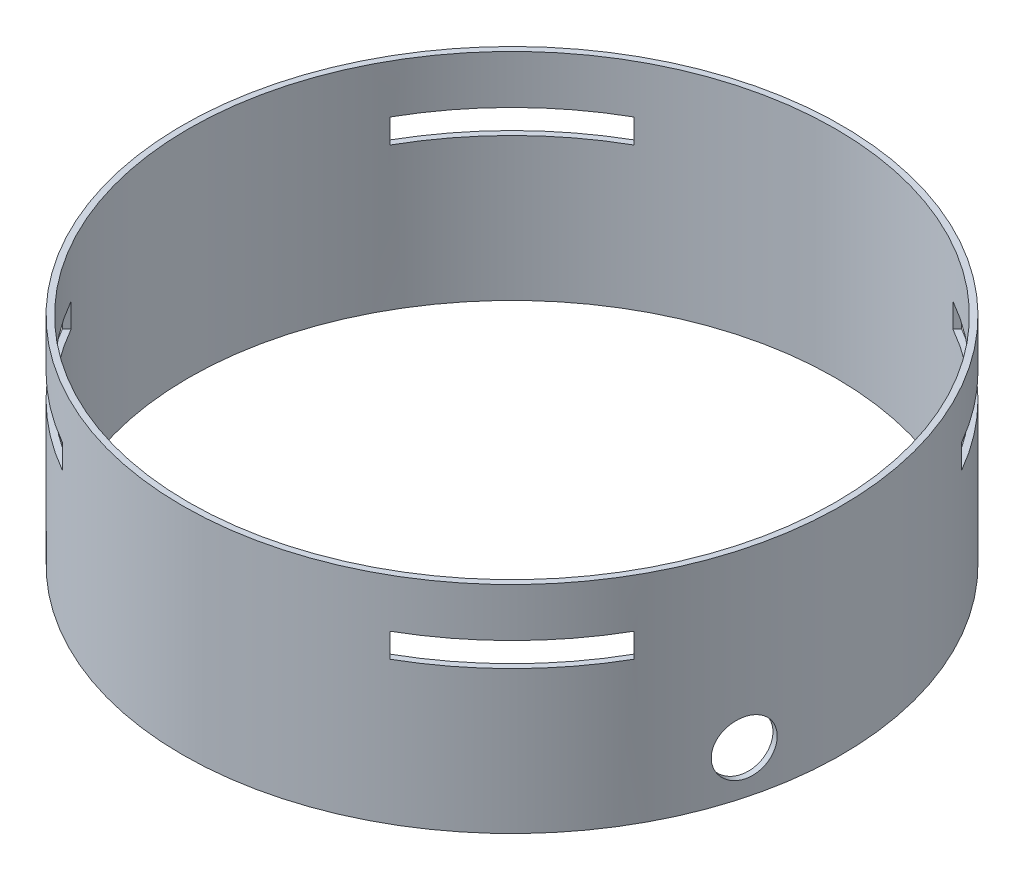
ISO-10303-21;
HEADER;
FILE_DESCRIPTION(('STEP AP214'),'2;1');
FILE_NAME('part.step','',(''),(''),'','','');
FILE_SCHEMA(('AUTOMOTIVE_DESIGN { 1 0 10303 214 1 1 1 1 }'));
ENDSEC;
DATA;
#1=APPLICATION_CONTEXT('core data for automotive mechanical design processes');
#2=APPLICATION_PROTOCOL_DEFINITION('international standard','automotive_design',2000,#1);
#3=PRODUCT_CONTEXT('',#1,'mechanical');
#4=PRODUCT('Part','Part','',(#3));
#5=PRODUCT_RELATED_PRODUCT_CATEGORY('part','',(#4));
#6=PRODUCT_DEFINITION_FORMATION('','',#4);
#7=PRODUCT_DEFINITION_CONTEXT('part definition',#1,'design');
#8=PRODUCT_DEFINITION('design','',#6,#7);
#9=PRODUCT_DEFINITION_SHAPE('','',#8);
#10=(LENGTH_UNIT() NAMED_UNIT(*) SI_UNIT(.MILLI.,.METRE.));
#11=(NAMED_UNIT(*) PLANE_ANGLE_UNIT() SI_UNIT($,.RADIAN.));
#12=(NAMED_UNIT(*) SI_UNIT($,.STERADIAN.) SOLID_ANGLE_UNIT());
#13=UNCERTAINTY_MEASURE_WITH_UNIT(LENGTH_MEASURE(1.E-05),#10,'distance_accuracy_value','');
#14=(GEOMETRIC_REPRESENTATION_CONTEXT(3) GLOBAL_UNCERTAINTY_ASSIGNED_CONTEXT((#13)) GLOBAL_UNIT_ASSIGNED_CONTEXT((#10,
#11,#12)) REPRESENTATION_CONTEXT('',''));
#15=CARTESIAN_POINT('',(0.,0.,0.));
#16=DIRECTION('',(0.,0.,1.));
#17=DIRECTION('',(1.,0.,0.));
#18=AXIS2_PLACEMENT_3D('',#15,#16,#17);
#19=CARTESIAN_POINT('',(0.,25.4,0.));
#20=DIRECTION('',(0.,1.,0.));
#21=DIRECTION('',(0.,0.,1.));
#22=AXIS2_PLACEMENT_3D('',#19,#20,#21);
#23=PLANE('',#22);
#24=CARTESIAN_POINT('',(0.,25.4,0.));
#25=DIRECTION('',(0.,1.,0.));
#26=DIRECTION('',(0.,0.,1.));
#27=AXIS2_PLACEMENT_3D('',#24,#25,#26);
#28=CIRCLE('',#27,77.6224);
#29=CARTESIAN_POINT('',(0.,25.4,77.6224));
#30=VERTEX_POINT('',#29);
#31=EDGE_CURVE('E286',#30,#30,#28,.T.);
#32=ORIENTED_EDGE('',*,*,#31,.T.);
#33=EDGE_LOOP('',(#32));
#34=FACE_BOUND('',#33,.T.);
#35=CARTESIAN_POINT('',(0.,25.4,0.));
#36=DIRECTION('',(0.,1.,0.));
#37=DIRECTION('',(0.,0.,1.));
#38=AXIS2_PLACEMENT_3D('',#35,#36,#37);
#39=CIRCLE('',#38,76.2);
#40=CARTESIAN_POINT('',(0.,25.4,76.2));
#41=VERTEX_POINT('',#40);
#42=EDGE_CURVE('E280',#41,#41,#39,.T.);
#43=ORIENTED_EDGE('',*,*,#42,.F.);
#44=EDGE_LOOP('',(#43));
#45=FACE_BOUND('',#44,.T.);
#46=ADVANCED_FACE('F35',(#34,#45),#23,.T.);
#47=CARTESIAN_POINT('',(0.,-25.4,0.));
#48=DIRECTION('',(0.,1.,0.));
#49=DIRECTION('',(0.,0.,1.));
#50=AXIS2_PLACEMENT_3D('',#47,#48,#49);
#51=PLANE('',#50);
#52=CARTESIAN_POINT('',(0.,-25.4,0.));
#53=DIRECTION('',(0.,1.,0.));
#54=DIRECTION('',(0.,0.,1.));
#55=AXIS2_PLACEMENT_3D('',#52,#53,#54);
#56=CIRCLE('',#55,77.6224);
#57=CARTESIAN_POINT('',(0.,-25.4,77.6224));
#58=VERTEX_POINT('',#57);
#59=EDGE_CURVE('E283',#58,#58,#56,.T.);
#60=ORIENTED_EDGE('',*,*,#59,.F.);
#61=EDGE_LOOP('',(#60));
#62=FACE_BOUND('',#61,.T.);
#63=CARTESIAN_POINT('',(0.,-25.4,0.));
#64=DIRECTION('',(0.,1.,0.));
#65=DIRECTION('',(0.,0.,1.));
#66=AXIS2_PLACEMENT_3D('',#63,#64,#65);
#67=CIRCLE('',#66,76.2);
#68=CARTESIAN_POINT('',(0.,-25.4,76.2));
#69=VERTEX_POINT('',#68);
#70=EDGE_CURVE('E279',#69,#69,#67,.T.);
#71=ORIENTED_EDGE('',*,*,#70,.T.);
#72=EDGE_LOOP('',(#71));
#73=FACE_BOUND('',#72,.T.);
#74=ADVANCED_FACE('F327',(#62,#73),#51,.F.);
#75=CARTESIAN_POINT('',(0.,25.4,0.));
#76=DIRECTION('',(0.,-1.,0.));
#77=DIRECTION('',(0.,0.,-1.));
#78=AXIS2_PLACEMENT_3D('',#75,#76,#77);
#79=CYLINDRICAL_SURFACE('',#78,77.6224);
#80=CARTESIAN_POINT('',(76.3696759436952,-15.24,13.8891892497357));
#81=CARTESIAN_POINT('',(76.3696760067648,-15.4180840873903,13.8891876221976));
#82=CARTESIAN_POINT('',(76.368331440787,-15.5961433564957,13.8965877599853));
#83=CARTESIAN_POINT('',(76.362949742464,-15.9510512124609,13.9261309276265));
#84=CARTESIAN_POINT('',(76.3589119435585,-16.1278994886574,13.9482776071652));
#85=CARTESIAN_POINT('',(76.3481301495338,-16.4792112390227,14.0071730637191));
#86=CARTESIAN_POINT('',(76.3413839127847,-16.6536726136925,14.0439339358775));
#87=CARTESIAN_POINT('',(76.3251693711906,-16.9988875095834,14.1317902861189));
#88=CARTESIAN_POINT('',(76.3157000705826,-17.1696396498093,14.182891007797));
#89=CARTESIAN_POINT('',(76.2940348323088,-17.5059994495651,14.2989758537423));
#90=CARTESIAN_POINT('',(76.2818414501073,-17.671611766006,14.3639469636608));
#91=CARTESIAN_POINT('',(76.2547019366405,-17.9967493020921,14.5073338992367));
#92=CARTESIAN_POINT('',(76.2397547918003,-18.1562722542467,14.5857546745631));
#93=CARTESIAN_POINT('',(76.2071066956301,-18.4679505259299,14.7553828237956));
#94=CARTESIAN_POINT('',(76.1894073662966,-18.6201101162292,14.8465826632663));
#95=CARTESIAN_POINT('',(76.151233666876,-18.9161481762052,15.0411575765521));
#96=CARTESIAN_POINT('',(76.1307582724023,-19.0600235609017,15.1445371429132));
#97=CARTESIAN_POINT('',(76.0869991275901,-19.3386774878385,15.3628760411242));
#98=CARTESIAN_POINT('',(76.0637103076595,-19.473438905008,15.47785621311));
#99=CARTESIAN_POINT('',(76.0143604432403,-19.7326746158362,15.7184308051393));
#100=CARTESIAN_POINT('',(75.9882983775546,-19.8571450898539,15.8440291316013));
#101=CARTESIAN_POINT('',(75.9334512371063,-20.0948264659596,16.104835029412));
#102=CARTESIAN_POINT('',(75.9046670498336,-20.2080410132789,16.2400394653416));
#103=CARTESIAN_POINT('',(75.8444127318524,-20.4224955969457,16.5191533277182));
#104=CARTESIAN_POINT('',(75.8129416137929,-20.5237311985724,16.6630659484045));
#105=CARTESIAN_POINT('',(75.7473699342826,-20.7135578277944,16.9586515939802));
#106=CARTESIAN_POINT('',(75.7132667052664,-20.8021357610294,17.110332437949));
#107=CARTESIAN_POINT('',(75.6425588245687,-20.9659199248556,17.4202627673212));
#108=CARTESIAN_POINT('',(75.6059532520257,-21.0411211957699,17.5785146623667));
#109=CARTESIAN_POINT('',(75.5304063919072,-21.1775449341174,17.9003342574498));
#110=CARTESIAN_POINT('',(75.4914660041791,-21.2387727438062,18.0638998985527));
#111=CARTESIAN_POINT('',(75.4114197864511,-21.3468618340087,18.3952140124456));
#112=CARTESIAN_POINT('',(75.3703131645034,-21.3937178170637,18.5629640030108));
#113=CARTESIAN_POINT('',(75.2442726342324,-21.5119260357275,19.0697861018048));
#114=CARTESIAN_POINT('',(75.1563640163169,-21.5613778343358,19.4135172540467));
#115=CARTESIAN_POINT('',(74.974970034007,-21.6000202969517,20.1026878180747));
#116=CARTESIAN_POINT('',(74.8814847699647,-21.5892120450202,20.4481271990184));
#117=CARTESIAN_POINT('',(74.6918526606246,-21.5078285159064,21.1302885706652));
#118=CARTESIAN_POINT('',(74.5957127179983,-21.4373962878793,21.4670294397818));
#119=CARTESIAN_POINT('',(74.4037551025381,-21.2389655586893,22.1231818037319));
#120=CARTESIAN_POINT('',(74.3079374326841,-21.1109665266959,22.4425931387373));
#121=CARTESIAN_POINT('',(74.12000640733,-20.8008815294537,23.0556861129745));
#122=CARTESIAN_POINT('',(74.02789759294,-20.618731419096,23.3493366998143));
#123=CARTESIAN_POINT('',(73.8511402498443,-20.2055599184151,23.9025213990573));
#124=CARTESIAN_POINT('',(73.7664918669273,-19.9745375733506,24.162054844806));
#125=CARTESIAN_POINT('',(73.6079768341488,-19.4693732848601,24.6407514631334));
#126=CARTESIAN_POINT('',(73.534142492344,-19.1951070180858,24.8597941566152));
#127=CARTESIAN_POINT('',(73.4008336949819,-18.6116736460876,25.2506907740957));
#128=CARTESIAN_POINT('',(73.3413592506475,-18.302506513587,25.4225446612138));
#129=CARTESIAN_POINT('',(73.2395201491425,-17.65796066401,25.7144646515445));
#130=CARTESIAN_POINT('',(73.1971574943141,-17.3225788848944,25.8345246941936));
#131=CARTESIAN_POINT('',(73.1315817933363,-16.6351653255872,26.0195781880569));
#132=CARTESIAN_POINT('',(73.1083683594072,-16.2831338827108,26.0845727543709));
#133=CARTESIAN_POINT('',(73.0822631642602,-15.5735050949139,26.1576245729452));
#134=CARTESIAN_POINT('',(73.0793127550518,-15.2159268179207,26.1658461456698));
#135=CARTESIAN_POINT('',(73.0937226450729,-14.5043959954094,26.1255647090385));
#136=CARTESIAN_POINT('',(73.111082761839,-14.1504434173479,26.0770622092739));
#137=CARTESIAN_POINT('',(73.1652277650047,-13.4567100257106,25.9247541619736));
#138=CARTESIAN_POINT('',(73.2019857080003,-13.1169102585969,25.8210253215499));
#139=CARTESIAN_POINT('',(73.2931517351944,-12.4605412228013,25.5610983470831));
#140=CARTESIAN_POINT('',(73.3475600924833,-12.1439723136443,25.4048994012119));
#141=CARTESIAN_POINT('',(73.4716420993103,-11.5422551553502,25.0437853623144));
#142=CARTESIAN_POINT('',(73.5413504194775,-11.2571805162128,24.8387595334443));
#143=CARTESIAN_POINT('',(73.6928330062573,-10.7272880149326,24.3856567463518));
#144=CARTESIAN_POINT('',(73.7746074730207,-10.482470820715,24.137579073982));
#145=CARTESIAN_POINT('',(73.9469315068391,-10.0394491081283,23.6043820110808));
#146=CARTESIAN_POINT('',(74.0375016050255,-9.84135753921046,23.3191753977824));
#147=CARTESIAN_POINT('',(74.2235837119847,-9.49818683572989,22.7199222009803));
#148=CARTESIAN_POINT('',(74.3190956729068,-9.3531071879785,22.4058758966997));
#149=CARTESIAN_POINT('',(74.5113235314916,-9.12026589800136,21.7580714655499));
#150=CARTESIAN_POINT('',(74.6080378115417,-9.03243428023167,21.4243379492695));
#151=CARTESIAN_POINT('',(74.7995158902683,-8.91637920588395,20.745921996566));
#152=CARTESIAN_POINT('',(74.8942797243591,-8.88815466606777,20.4012397592292));
#153=CARTESIAN_POINT('',(75.0325381885292,-8.89106482250385,19.884347026837));
#154=CARTESIAN_POINT('',(75.077936230706,-8.8995473187595,19.7122304841323));
#155=CARTESIAN_POINT('',(75.1672130690802,-8.93142727214375,19.3690059216578));
#156=CARTESIAN_POINT('',(75.2110924217788,-8.95481920359911,19.1978975519444));
#157=CARTESIAN_POINT('',(75.2970739059451,-9.01636673499527,18.857848344573));
#158=CARTESIAN_POINT('',(75.3391753771938,-9.0545277669123,18.6889083280677));
#159=CARTESIAN_POINT('',(75.4213374970237,-9.14531730629655,18.3545213856119));
#160=CARTESIAN_POINT('',(75.4613988880074,-9.19794050561506,18.189073201975));
#161=CARTESIAN_POINT('',(75.5393090983014,-9.31730145819666,17.8627521981321));
#162=CARTESIAN_POINT('',(75.5771572263654,-9.38404359134981,17.7018808153228));
#163=CARTESIAN_POINT('',(75.650450987402,-9.53112760945773,17.385986617529));
#164=CARTESIAN_POINT('',(75.6858974949814,-9.61146450587293,17.2309616826408));
#165=CARTESIAN_POINT('',(75.7542858416492,-9.78521372239024,16.9277677737642));
#166=CARTESIAN_POINT('',(75.7872268091416,-9.87863056076712,16.7796011925273));
#167=CARTESIAN_POINT('',(75.850480983679,-10.0778204133294,16.4913095611631));
#168=CARTESIAN_POINT('',(75.880795144749,-10.1835889084966,16.3511815978075));
#169=CARTESIAN_POINT('',(75.9388308897275,-10.4071170404264,16.0794995237938));
#170=CARTESIAN_POINT('',(75.9665439874417,-10.5249134762084,15.9479738750081));
#171=CARTESIAN_POINT('',(76.0192133318407,-10.7713408772402,15.6949953144464));
#172=CARTESIAN_POINT('',(76.0441705845679,-10.8999678582903,15.5735387309427));
#173=CARTESIAN_POINT('',(76.0913287694689,-11.1672693547329,15.3414699761527));
#174=CARTESIAN_POINT('',(76.1135280070798,-11.3059499651737,15.230864480617));
#175=CARTESIAN_POINT('',(76.1551351616697,-11.5922583919074,15.0214435940181));
#176=CARTESIAN_POINT('',(76.1745441057776,-11.7398828872952,14.9226238668153));
#177=CARTESIAN_POINT('',(76.2106226040634,-12.0434182704181,14.737263083687));
#178=CARTESIAN_POINT('',(76.2272860538871,-12.199346629794,14.6507494460215));
#179=CARTESIAN_POINT('',(76.2578268383598,-12.5180259658458,14.4909435947119));
#180=CARTESIAN_POINT('',(76.2717051922703,-12.6807744201159,14.4176465451932));
#181=CARTESIAN_POINT('',(76.2966882038033,-13.0118552096128,14.2848492273822));
#182=CARTESIAN_POINT('',(76.3077951968965,-13.1801827068303,14.2253373451565));
#183=CARTESIAN_POINT('',(76.327264086782,-13.5212944431417,14.1205019353024));
#184=CARTESIAN_POINT('',(76.3356266735538,-13.6940775502363,14.0751748415654));
#185=CARTESIAN_POINT('',(76.3516525762584,-14.0934329578403,13.988018619653));
#186=CARTESIAN_POINT('',(76.3584138617801,-14.3211069045834,13.9509941626566));
#187=CARTESIAN_POINT('',(76.3674254989021,-14.7792010836709,13.9015805621144));
#188=CARTESIAN_POINT('',(76.3696758621052,-15.0096213089497,13.8891913552022));
#189=CARTESIAN_POINT('',(76.3696759436952,-15.24,13.8891892497357));
#190=B_SPLINE_CURVE_WITH_KNOTS('',3,(#80,#81,#82,#83,#84,#85,#86,#87,#88,#89,#90,#91,#92,#93,
#94,#95,#96,#97,#98,#99,#100,#101,#102,#103,#104,#105,#106,#107,#108,#109,#110,#111,#112,#113,
#114,#115,#116,#117,#118,#119,#120,#121,#122,#123,#124,#125,#126,#127,#128,#129,#130,#131,#132,
#133,#134,#135,#136,#137,#138,#139,#140,#141,#142,#143,#144,#145,#146,#147,#148,#149,#150,#151,
#152,#153,#154,#155,#156,#157,#158,#159,#160,#161,#162,#163,#164,#165,#166,#167,#168,#169,#170,
#171,#172,#173,#174,#175,#176,#177,#178,#179,#180,#181,#182,#183,#184,#185,#186,#187,#188,#189),
.UNSPECIFIED.,.T.,.F.,(4,2,2,2,2,2,2,2,2,2,2,2,2,2,2,2,2,2,2,2,2,2,2,2,2,2,2,2,2,2,2,2,2,2,2,2,
2,2,2,2,2,2,2,2,2,2,2,2,2,2,2,2,2,2,4),(0.,0.534050873120326,1.06823396994757,1.60286009616831,
2.13768197228709,2.67200422251667,3.20652353456738,3.74072901402031,4.27513215808505,
4.81051303915312,5.34609175118616,5.88149644720853,6.41709873912684,6.95325116154748,
7.48960196118379,8.02574736138516,8.5620901480697,9.63120058845834,10.7002917959211,
11.7668252977429,12.8333686343999,13.901180422261,14.9690130722392,16.039973608454,
17.1109349816793,18.1820216375552,19.2530866029455,20.3210502357068,21.3890042742894,
22.4554788237283,23.5219698746367,24.5909030787347,25.6598540160828,26.731363028745,
27.8028616682535,28.873048122644,29.9432151283918,30.4773107418947,31.0112085260973,
31.5453028612241,32.0792014252411,32.6132658555454,33.1471347364905,33.6811884917122,
34.2150474648114,34.7505916959785,35.2859397717035,35.8216151629103,36.3570928601057,
36.8937455290241,37.430201439554,37.966203731386,38.5020711617942,39.1929484848286,
39.883824030795),.UNSPECIFIED.);
#191=CARTESIAN_POINT('',(76.3696759436952,-15.24,13.8891892497357));
#192=VERTEX_POINT('',#191);
#193=EDGE_CURVE('E175',#192,#192,#190,.T.);
#194=ORIENTED_EDGE('',*,*,#193,.T.);
#195=EDGE_LOOP('',(#194));
#196=FACE_BOUND('',#195,.T.);
#197=CARTESIAN_POINT('',(0.,8.255,0.));
#198=DIRECTION('',(0.,-1.,0.));
#199=DIRECTION('',(0.,0.,-1.));
#200=AXIS2_PLACEMENT_3D('',#197,#198,#199);
#201=CIRCLE('',#200,77.6224);
#202=CARTESIAN_POINT('',(-67.3416793820607,8.255,-38.604859794639));
#203=VERTEX_POINT('',#202);
#204=CARTESIAN_POINT('',(-38.6048597946396,8.255,-67.3416793820604));
#205=VERTEX_POINT('',#204);
#206=EDGE_CURVE('E248',#203,#205,#201,.T.);
#207=ORIENTED_EDGE('',*,*,#206,.T.);
#208=DIRECTION('',(0.,-1.,0.));
#209=VECTOR('',#208,1.);
#210=CARTESIAN_POINT('',(-38.6048597946396,25.4,-67.3416793820604));
#211=LINE('',#210,#209);
#212=CARTESIAN_POINT('',(-38.6048597946396,13.97,-67.3416793820604));
#213=VERTEX_POINT('',#212);
#214=EDGE_CURVE('E219',#205,#213,#211,.F.);
#215=ORIENTED_EDGE('',*,*,#214,.T.);
#216=CARTESIAN_POINT('',(0.,13.97,0.));
#217=DIRECTION('',(0.,1.,0.));
#218=DIRECTION('',(0.,0.,1.));
#219=AXIS2_PLACEMENT_3D('',#216,#217,#218);
#220=CIRCLE('',#219,77.6224);
#221=CARTESIAN_POINT('',(-67.3416793820607,13.97,-38.604859794639));
#222=VERTEX_POINT('',#221);
#223=EDGE_CURVE('E246',#213,#222,#220,.T.);
#224=ORIENTED_EDGE('',*,*,#223,.T.);
#225=DIRECTION('',(0.,-1.,0.));
#226=VECTOR('',#225,1.);
#227=CARTESIAN_POINT('',(-67.3416793820607,25.4,-38.604859794639));
#228=LINE('',#227,#226);
#229=EDGE_CURVE('E228',#222,#203,#228,.T.);
#230=ORIENTED_EDGE('',*,*,#229,.T.);
#231=EDGE_LOOP('',(#207,#215,#224,#230));
#232=FACE_BOUND('',#231,.T.);
#233=CARTESIAN_POINT('',(-38.6048597946393,8.255,67.3416793820606));
#234=VERTEX_POINT('',#233);
#235=CARTESIAN_POINT('',(-67.3416793820606,8.255,38.6048597946393));
#236=VERTEX_POINT('',#235);
#237=EDGE_CURVE('E250',#234,#236,#201,.T.);
#238=ORIENTED_EDGE('',*,*,#237,.T.);
#239=DIRECTION('',(0.,-1.,0.));
#240=VECTOR('',#239,1.);
#241=CARTESIAN_POINT('',(-67.3416793820606,25.4,38.6048597946393));
#242=LINE('',#241,#240);
#243=CARTESIAN_POINT('',(-67.3416793820606,13.97,38.6048597946393));
#244=VERTEX_POINT('',#243);
#245=EDGE_CURVE('E240',#236,#244,#242,.F.);
#246=ORIENTED_EDGE('',*,*,#245,.T.);
#247=CARTESIAN_POINT('',(-38.6048597946392,13.97,67.3416793820606));
#248=VERTEX_POINT('',#247);
#249=EDGE_CURVE('E243',#244,#248,#220,.T.);
#250=ORIENTED_EDGE('',*,*,#249,.T.);
#251=DIRECTION('',(0.,-1.,0.));
#252=VECTOR('',#251,1.);
#253=CARTESIAN_POINT('',(-38.6048597946393,25.4,67.3416793820606));
#254=LINE('',#253,#252);
#255=EDGE_CURVE('E237',#248,#234,#254,.T.);
#256=ORIENTED_EDGE('',*,*,#255,.T.);
#257=EDGE_LOOP('',(#238,#246,#250,#256));
#258=FACE_BOUND('',#257,.T.);
#259=CARTESIAN_POINT('',(38.60485979464,13.97,67.3416793820601));
#260=VERTEX_POINT('',#259);
#261=CARTESIAN_POINT('',(67.3416793820607,13.97,38.6048597946391));
#262=VERTEX_POINT('',#261);
#263=EDGE_CURVE('E173',#260,#262,#220,.T.);
#264=ORIENTED_EDGE('',*,*,#263,.T.);
#265=DIRECTION('',(0.,-1.,0.));
#266=VECTOR('',#265,1.);
#267=CARTESIAN_POINT('',(67.3416793820607,25.4,38.6048597946391));
#268=LINE('',#267,#266);
#269=CARTESIAN_POINT('',(67.3416793820607,8.255,38.6048597946391));
#270=VERTEX_POINT('',#269);
#271=EDGE_CURVE('E253',#262,#270,#268,.T.);
#272=ORIENTED_EDGE('',*,*,#271,.T.);
#273=CARTESIAN_POINT('',(38.60485979464,8.255,67.3416793820601));
#274=VERTEX_POINT('',#273);
#275=EDGE_CURVE('E251',#270,#274,#201,.T.);
#276=ORIENTED_EDGE('',*,*,#275,.T.);
#277=DIRECTION('',(0.,-1.,0.));
#278=VECTOR('',#277,1.);
#279=CARTESIAN_POINT('',(38.60485979464,25.4,67.3416793820601));
#280=LINE('',#279,#278);
#281=EDGE_CURVE('E220',#274,#260,#280,.F.);
#282=ORIENTED_EDGE('',*,*,#281,.T.);
#283=EDGE_LOOP('',(#264,#272,#276,#282));
#284=FACE_BOUND('',#283,.T.);
#285=CARTESIAN_POINT('',(0.,8.255,0.));
#286=DIRECTION('',(0.,-1.,0.));
#287=DIRECTION('',(0.,0.,-1.));
#288=AXIS2_PLACEMENT_3D('',#285,#286,#287);
#289=CIRCLE('',#288,77.6224);
#290=CARTESIAN_POINT('',(38.6048597946392,8.255,-67.3416793820606));
#291=VERTEX_POINT('',#290);
#292=CARTESIAN_POINT('',(67.3416793820606,8.255,-38.6048597946393));
#293=VERTEX_POINT('',#292);
#294=EDGE_CURVE('E273',#291,#293,#289,.T.);
#295=ORIENTED_EDGE('',*,*,#294,.T.);
#296=DIRECTION('',(0.,-1.,0.));
#297=VECTOR('',#296,1.);
#298=CARTESIAN_POINT('',(67.3416793820606,25.4,-38.6048597946393));
#299=LINE('',#298,#297);
#300=CARTESIAN_POINT('',(67.3416793820606,13.97,-38.6048597946393));
#301=VERTEX_POINT('',#300);
#302=EDGE_CURVE('E276',#293,#301,#299,.F.);
#303=ORIENTED_EDGE('',*,*,#302,.T.);
#304=CARTESIAN_POINT('',(0.,13.97,0.));
#305=DIRECTION('',(0.,1.,0.));
#306=DIRECTION('',(0.,0.,1.));
#307=AXIS2_PLACEMENT_3D('',#304,#305,#306);
#308=CIRCLE('',#307,77.6224);
#309=CARTESIAN_POINT('',(38.6048597946393,13.97,-67.3416793820606));
#310=VERTEX_POINT('',#309);
#311=EDGE_CURVE('E260',#301,#310,#308,.T.);
#312=ORIENTED_EDGE('',*,*,#311,.T.);
#313=DIRECTION('',(0.,-1.,0.));
#314=VECTOR('',#313,1.);
#315=CARTESIAN_POINT('',(38.6048597946393,25.4,-67.3416793820606));
#316=LINE('',#315,#314);
#317=EDGE_CURVE('E270',#310,#291,#316,.T.);
#318=ORIENTED_EDGE('',*,*,#317,.T.);
#319=EDGE_LOOP('',(#295,#303,#312,#318));
#320=FACE_BOUND('',#319,.T.);
#321=ORIENTED_EDGE('',*,*,#31,.F.);
#322=EDGE_LOOP('',(#321));
#323=FACE_BOUND('',#322,.T.);
#324=ORIENTED_EDGE('',*,*,#59,.T.);
#325=EDGE_LOOP('',(#324));
#326=FACE_BOUND('',#325,.T.);
#327=ADVANCED_FACE('F37',(#196,#232,#258,#284,#320,#323,#326),#79,.T.);
#328=CARTESIAN_POINT('',(0.,25.4,0.));
#329=DIRECTION('',(0.,-1.,0.));
#330=DIRECTION('',(0.,0.,-1.));
#331=AXIS2_PLACEMENT_3D('',#328,#329,#330);
#332=CYLINDRICAL_SURFACE('',#331,76.2);
#333=CARTESIAN_POINT('',(74.9910357832042,-15.24,13.519783732079));
#334=CARTESIAN_POINT('',(74.9910358402639,-15.4180719702647,13.519782090402));
#335=CARTESIAN_POINT('',(74.9897026497337,-15.5961189783645,13.5271842263217));
#336=CARTESIAN_POINT('',(74.9843661335385,-15.9510022245845,13.556735220421));
#337=CARTESIAN_POINT('',(74.9803621484319,-16.1278381527821,13.5788877205875));
#338=CARTESIAN_POINT('',(74.9696695475558,-16.4791247056945,13.6377982342823));
#339=CARTESIAN_POINT('',(74.9629787143209,-16.6535732368057,13.6745683114972));
#340=CARTESIAN_POINT('',(74.9468950412762,-16.9987625125547,13.7624459317439));
#341=CARTESIAN_POINT('',(74.9375012129991,-17.169501876164,13.8135587196397));
#342=CARTESIAN_POINT('',(74.916004850316,-17.505835865464,13.9296696530872));
#343=CARTESIAN_POINT('',(74.9039048637211,-17.6714351645355,13.9946547354603));
#344=CARTESIAN_POINT('',(74.8769675696476,-17.9965473703442,14.1380709252443));
#345=CARTESIAN_POINT('',(74.8621292542587,-18.1560580098232,14.2165069828681));
#346=CARTESIAN_POINT('',(74.8297111370588,-18.4677130363587,14.3861663237595));
#347=CARTESIAN_POINT('',(74.8121329468327,-18.6198616852075,14.4773820868793));
#348=CARTESIAN_POINT('',(74.7742106223098,-18.9158795891963,14.6719887059059));
#349=CARTESIAN_POINT('',(74.7538654668784,-19.0597457596989,14.7753840547336));
#350=CARTESIAN_POINT('',(74.7103707886967,-19.3383945445613,14.9937623986853));
#351=CARTESIAN_POINT('',(74.6872159877024,-19.4731592981855,15.1087671331046));
#352=CARTESIAN_POINT('',(74.6381354885443,-19.7324028089095,15.3493911581652));
#353=CARTESIAN_POINT('',(74.6122087696292,-19.8568777466842,15.4750143554367));
#354=CARTESIAN_POINT('',(74.5576297315973,-20.0945694312501,15.7358696697887));
#355=CARTESIAN_POINT('',(74.5289783002773,-20.2077898207007,15.8710986533934));
#356=CARTESIAN_POINT('',(74.4689832466984,-20.4222575590982,16.1502607001277));
#357=CARTESIAN_POINT('',(74.43763863478,-20.5235004739355,16.2941969571076));
#358=CARTESIAN_POINT('',(74.372308449198,-20.7133482926369,16.5898363854602));
#359=CARTESIAN_POINT('',(74.3383200577136,-20.8019394186553,16.7415477834206));
#360=CARTESIAN_POINT('',(74.2678284062168,-20.9657498133543,17.051537881023));
#361=CARTESIAN_POINT('',(74.2313242202762,-21.040964121888,17.2098189900045));
#362=CARTESIAN_POINT('',(74.1559637007638,-21.1774134064943,17.5316948442234));
#363=CARTESIAN_POINT('',(74.1171082743897,-21.2386537312934,17.6952875289043));
#364=CARTESIAN_POINT('',(74.0372132089691,-21.3467669965982,18.0266528702492));
#365=CARTESIAN_POINT('',(73.9961727711386,-21.3936346399031,18.1944270434701));
#366=CARTESIAN_POINT('',(73.8703063732629,-21.5118692441254,18.7012874350092));
#367=CARTESIAN_POINT('',(73.7824754851912,-21.5613389398442,19.0450262947247));
#368=CARTESIAN_POINT('',(73.6011471000854,-21.600020471653,19.7341922847202));
#369=CARTESIAN_POINT('',(73.5076497084596,-21.5892334282992,20.0796193834858));
#370=CARTESIAN_POINT('',(73.3179144353622,-21.5078990333897,20.7617042350564));
#371=CARTESIAN_POINT('',(73.2216839333448,-21.4375001029388,21.0983816289224));
#372=CARTESIAN_POINT('',(73.0294690776816,-21.2391501242075,21.7543924115365));
#373=CARTESIAN_POINT('',(72.9334847263866,-21.1111985283408,22.0737256352308));
#374=CARTESIAN_POINT('',(72.7451581891624,-20.801215437444,22.686669790917));
#375=CARTESIAN_POINT('',(72.6528206401204,-20.6191174540185,22.9802485206595));
#376=CARTESIAN_POINT('',(72.4755726348881,-20.206057460257,23.5332921473862));
#377=CARTESIAN_POINT('',(72.3906623293987,-19.9750944587601,23.7927563522301));
#378=CARTESIAN_POINT('',(72.2316085500085,-19.4700242814472,24.2713546576644));
#379=CARTESIAN_POINT('',(72.157498586675,-19.1957881014448,24.490363776588));
#380=CARTESIAN_POINT('',(72.0236655528563,-18.6124055991672,24.8812060535303));
#381=CARTESIAN_POINT('',(71.9639424942308,-18.3032592481145,25.0530391726601));
#382=CARTESIAN_POINT('',(71.8616603685797,-17.6587411108626,25.3449365920436));
#383=CARTESIAN_POINT('',(71.8191034186302,-17.3233660959982,25.4649945070476));
#384=CARTESIAN_POINT('',(71.7532158948204,-16.6359540408652,25.650063226984));
#385=CARTESIAN_POINT('',(71.7298849167552,-16.2839173510544,25.7150751891975));
#386=CARTESIAN_POINT('',(71.7036361325607,-15.5743072652047,25.788177516094));
#387=CARTESIAN_POINT('',(71.7006572057165,-15.2167536820228,25.7964383147106));
#388=CARTESIAN_POINT('',(71.7150972804281,-14.5052647180143,25.7562664193095));
#389=CARTESIAN_POINT('',(71.7325160917262,-14.1513293034709,25.7078342540892));
#390=CARTESIAN_POINT('',(71.7868558117002,-13.4576416400849,25.5556994581878));
#391=CARTESIAN_POINT('',(71.8237486154484,-13.117869710973,25.4520764771291));
#392=CARTESIAN_POINT('',(71.9152439197472,-12.4615442804217,25.1923903985917));
#393=CARTESIAN_POINT('',(71.9698467044604,-12.1449911516357,25.0363264596786));
#394=CARTESIAN_POINT('',(72.0943595527524,-11.5432633403308,24.6754877803511));
#395=CARTESIAN_POINT('',(72.1643056687612,-11.2581649794959,24.4705982141134));
#396=CARTESIAN_POINT('',(72.3162750783604,-10.7282111054162,24.017769329695));
#397=CARTESIAN_POINT('',(72.3982985797652,-10.4833562847916,23.7698292707355));
#398=CARTESIAN_POINT('',(72.5711121217563,-10.0402236104581,23.2368719605676));
#399=CARTESIAN_POINT('',(72.6619234378876,-9.8420629965852,22.9517641155922));
#400=CARTESIAN_POINT('',(72.8484449967351,-9.49875007070588,22.3526802366635));
#401=CARTESIAN_POINT('',(72.944155190486,-9.3535972289943,22.0387044912255));
#402=CARTESIAN_POINT('',(73.1367094364613,-9.12061466420085,21.3910202372047));
#403=CARTESIAN_POINT('',(73.2335518960764,-9.03271244775667,21.0573372693717));
#404=CARTESIAN_POINT('',(73.4252055395191,-8.91651504641774,20.3789857753477));
#405=CARTESIAN_POINT('',(73.520016761762,-8.88821873325786,20.0343174572209));
#406=CARTESIAN_POINT('',(73.6582762908082,-8.89102253991123,19.5174380912865));
#407=CARTESIAN_POINT('',(73.7036606610809,-8.89946812871967,19.3453342619561));
#408=CARTESIAN_POINT('',(73.7928893357992,-8.93127156166443,19.0021263984078));
#409=CARTESIAN_POINT('',(73.8367342045398,-8.95462388033947,18.8310220174309));
#410=CARTESIAN_POINT('',(73.9226267344647,-9.01608963214387,18.4909722343648));
#411=CARTESIAN_POINT('',(73.9646737283076,-9.05420849445463,18.3220276499908));
#412=CARTESIAN_POINT('',(74.0467084474198,-9.14491130454368,17.9876232219216));
#413=CARTESIAN_POINT('',(74.0866969216768,-9.19748994636478,17.8221621239051));
#414=CARTESIAN_POINT('',(74.1644446475905,-9.31675918713632,17.4958081379208));
#415=CARTESIAN_POINT('',(74.2022032151661,-9.3834540881424,17.3349166595776));
#416=CARTESIAN_POINT('',(74.2753040532381,-9.53044147144393,17.0189744644724));
#417=CARTESIAN_POINT('',(74.31064720315,-9.6107289674687,16.8639216312832));
#418=CARTESIAN_POINT('',(74.3788179631479,-9.78437754807026,16.5606643590948));
#419=CARTESIAN_POINT('',(74.4116446963646,-9.87774315808676,16.4124623143949));
#420=CARTESIAN_POINT('',(74.4746629017555,-10.076829185434,16.1240926630279));
#421=CARTESIAN_POINT('',(74.5048553302727,-10.182545086311,15.9839221470376));
#422=CARTESIAN_POINT('',(74.5626463373845,-10.4059791071617,15.7121335507389));
#423=CARTESIAN_POINT('',(74.590236126478,-10.5237352822496,15.5805448840502));
#424=CARTESIAN_POINT('',(74.642658004102,-10.7700843877539,15.3274364381208));
#425=CARTESIAN_POINT('',(74.6674910987216,-10.8986733342819,15.2059129895946));
#426=CARTESIAN_POINT('',(74.7144037267937,-11.1659014709115,14.9737075905332));
#427=CARTESIAN_POINT('',(74.7364815680303,-11.3045467555524,14.8630323115707));
#428=CARTESIAN_POINT('',(74.7778524865882,-11.5907878895653,14.6534700592166));
#429=CARTESIAN_POINT('',(74.7971465886721,-11.7383804166771,14.5545787502033));
#430=CARTESIAN_POINT('',(74.8330061259466,-12.0418639103018,14.3690689911376));
#431=CARTESIAN_POINT('',(74.8495653288949,-12.1977727877352,14.282478633365));
#432=CARTESIAN_POINT('',(74.879910628823,-12.5164182618942,14.122521444593));
#433=CARTESIAN_POINT('',(74.893697740408,-12.679152334096,14.0491497764842));
#434=CARTESIAN_POINT('',(74.9185141870202,-13.0102099481206,13.9162066025271));
#435=CARTESIAN_POINT('',(74.9295458394191,-13.1785286573042,13.8566235034604));
#436=CARTESIAN_POINT('',(74.9488822600071,-13.5196280892671,13.7516504456804));
#437=CARTESIAN_POINT('',(74.9571877124237,-13.692407680684,13.7062569257731));
#438=CARTESIAN_POINT('',(74.9731163728553,-14.0920261580299,13.6188974874778));
#439=CARTESIAN_POINT('',(74.9798389019519,-14.3199749932112,13.5817666486964));
#440=CARTESIAN_POINT('',(74.9887985641436,-14.7786298519688,13.5322108674597));
#441=CARTESIAN_POINT('',(74.9910357092923,-15.0093358681341,13.5197858586125));
#442=CARTESIAN_POINT('',(74.9910357832042,-15.24,13.519783732079));
#443=B_SPLINE_CURVE_WITH_KNOTS('',3,(#333,#334,#335,#336,#337,#338,#339,#340,#341,#342,#343,
#344,#345,#346,#347,#348,#349,#350,#351,#352,#353,#354,#355,#356,#357,#358,#359,#360,#361,#362,
#363,#364,#365,#366,#367,#368,#369,#370,#371,#372,#373,#374,#375,#376,#377,#378,#379,#380,#381,
#382,#383,#384,#385,#386,#387,#388,#389,#390,#391,#392,#393,#394,#395,#396,#397,#398,#399,#400,
#401,#402,#403,#404,#405,#406,#407,#408,#409,#410,#411,#412,#413,#414,#415,#416,#417,#418,#419,
#420,#421,#422,#423,#424,#425,#426,#427,#428,#429,#430,#431,#432,#433,#434,#435,#436,#437,#438,
#439,#440,#441,#442),.UNSPECIFIED.,.T.,.F.,(4,2,2,2,2,2,2,2,2,2,2,2,2,2,2,2,2,2,2,2,2,2,2,2,2,2,
2,2,2,2,2,2,2,2,2,2,2,2,2,2,2,2,2,2,2,2,2,2,2,2,2,2,2,2,4),(0.,0.534014265780216,
1.06816043301738,1.60274834198872,2.1375319952038,2.67181426072716,3.20629357583423,
3.74045969025397,4.27482347366641,4.81020713221177,5.34578862789806,5.88119620838176,
6.41680138275325,6.95298545663901,7.48936793584652,8.02554476190679,8.56191896465659,
9.63100107910715,10.7000633125863,11.7664716051261,12.8328900442492,13.9006234249725,
14.9683784653054,16.0393789786569,17.1103803748706,18.1815138160877,19.2526247373339,
20.3205175085078,21.3884003191083,22.4547461546914,23.5211091010023,24.5900050587395,
25.6589194110182,26.7304896585072,27.8020491975326,28.8722492271524,29.9424289990435,
30.4764721128003,31.0103173882352,31.5443591279187,32.0782051640344,32.6122141293488,
33.1460276230516,33.6800262914724,34.2138302863477,34.7493769070153,35.2847274263336,
35.8204051446807,36.3558851610426,36.892569068912,37.4290561876096,37.9650905838781,
38.5009903420409,39.1927233972446,39.884454593553),.UNSPECIFIED.);
#444=CARTESIAN_POINT('',(74.9910357832042,-15.24,13.519783732079));
#445=VERTEX_POINT('',#444);
#446=EDGE_CURVE('E40',#445,#445,#443,.T.);
#447=ORIENTED_EDGE('',*,*,#446,.F.);
#448=EDGE_LOOP('',(#447));
#449=FACE_BOUND('',#448,.T.);
#450=DIRECTION('',(0.,-1.,0.));
#451=VECTOR('',#450,1.);
#452=CARTESIAN_POINT('',(-37.5620128889523,25.4,-66.2988324763731));
#453=LINE('',#452,#451);
#454=CARTESIAN_POINT('',(-37.5620128889522,8.255,-66.2988324763731));
#455=VERTEX_POINT('',#454);
#456=CARTESIAN_POINT('',(-37.5620128889523,13.97,-66.2988324763731));
#457=VERTEX_POINT('',#456);
#458=EDGE_CURVE('E11',#455,#457,#453,.F.);
#459=ORIENTED_EDGE('',*,*,#458,.F.);
#460=CARTESIAN_POINT('',(0.,8.255,0.));
#461=DIRECTION('',(0.,-1.,0.));
#462=DIRECTION('',(0.,0.,-1.));
#463=AXIS2_PLACEMENT_3D('',#460,#461,#462);
#464=CIRCLE('',#463,76.2);
#465=CARTESIAN_POINT('',(-66.2988324763734,8.255,-37.5620128889517));
#466=VERTEX_POINT('',#465);
#467=EDGE_CURVE('E50',#466,#455,#464,.T.);
#468=ORIENTED_EDGE('',*,*,#467,.F.);
#469=DIRECTION('',(0.,-1.,0.));
#470=VECTOR('',#469,1.);
#471=CARTESIAN_POINT('',(-66.2988324763734,25.4,-37.5620128889517));
#472=LINE('',#471,#470);
#473=CARTESIAN_POINT('',(-66.2988324763734,13.97,-37.5620128889517));
#474=VERTEX_POINT('',#473);
#475=EDGE_CURVE('E187',#474,#466,#472,.T.);
#476=ORIENTED_EDGE('',*,*,#475,.F.);
#477=CARTESIAN_POINT('',(0.,13.97,0.));
#478=DIRECTION('',(0.,1.,0.));
#479=DIRECTION('',(0.,0.,1.));
#480=AXIS2_PLACEMENT_3D('',#477,#478,#479);
#481=CIRCLE('',#480,76.2);
#482=EDGE_CURVE('E183',#457,#474,#481,.T.);
#483=ORIENTED_EDGE('',*,*,#482,.F.);
#484=EDGE_LOOP('',(#459,#468,#476,#483));
#485=FACE_BOUND('',#484,.T.);
#486=DIRECTION('',(0.,-1.,0.));
#487=VECTOR('',#486,1.);
#488=CARTESIAN_POINT('',(-66.2988324763732,25.4,37.562012888952));
#489=LINE('',#488,#487);
#490=CARTESIAN_POINT('',(-66.2988324763732,8.255,37.562012888952));
#491=VERTEX_POINT('',#490);
#492=CARTESIAN_POINT('',(-66.2988324763732,13.97,37.562012888952));
#493=VERTEX_POINT('',#492);
#494=EDGE_CURVE('E188',#491,#493,#489,.F.);
#495=ORIENTED_EDGE('',*,*,#494,.F.);
#496=CARTESIAN_POINT('',(-37.5620128889519,8.255,66.2988324763733));
#497=VERTEX_POINT('',#496);
#498=EDGE_CURVE('E186',#497,#491,#464,.T.);
#499=ORIENTED_EDGE('',*,*,#498,.F.);
#500=DIRECTION('',(0.,-1.,0.));
#501=VECTOR('',#500,1.);
#502=CARTESIAN_POINT('',(-37.5620128889519,25.4,66.2988324763733));
#503=LINE('',#502,#501);
#504=CARTESIAN_POINT('',(-37.5620128889519,13.97,66.2988324763733));
#505=VERTEX_POINT('',#504);
#506=EDGE_CURVE('E190',#505,#497,#503,.T.);
#507=ORIENTED_EDGE('',*,*,#506,.F.);
#508=EDGE_CURVE('E184',#493,#505,#481,.T.);
#509=ORIENTED_EDGE('',*,*,#508,.F.);
#510=EDGE_LOOP('',(#495,#499,#507,#509));
#511=FACE_BOUND('',#510,.T.);
#512=DIRECTION('',(0.,-1.,0.));
#513=VECTOR('',#512,1.);
#514=CARTESIAN_POINT('',(66.2988324763734,25.4,37.5620128889518));
#515=LINE('',#514,#513);
#516=CARTESIAN_POINT('',(66.2988324763734,13.97,37.5620128889518));
#517=VERTEX_POINT('',#516);
#518=CARTESIAN_POINT('',(66.2988324763734,8.255,37.5620128889518));
#519=VERTEX_POINT('',#518);
#520=EDGE_CURVE('E180',#517,#519,#515,.T.);
#521=ORIENTED_EDGE('',*,*,#520,.F.);
#522=CARTESIAN_POINT('',(37.5620128889527,13.97,66.2988324763729));
#523=VERTEX_POINT('',#522);
#524=EDGE_CURVE('E165',#523,#517,#481,.T.);
#525=ORIENTED_EDGE('',*,*,#524,.F.);
#526=DIRECTION('',(0.,-1.,0.));
#527=VECTOR('',#526,1.);
#528=CARTESIAN_POINT('',(37.5620128889527,25.4,66.2988324763729));
#529=LINE('',#528,#527);
#530=CARTESIAN_POINT('',(37.5620128889527,8.255,66.2988324763729));
#531=VERTEX_POINT('',#530);
#532=EDGE_CURVE('E154',#531,#523,#529,.F.);
#533=ORIENTED_EDGE('',*,*,#532,.F.);
#534=EDGE_CURVE('E181',#519,#531,#464,.T.);
#535=ORIENTED_EDGE('',*,*,#534,.F.);
#536=EDGE_LOOP('',(#521,#525,#533,#535));
#537=FACE_BOUND('',#536,.T.);
#538=DIRECTION('',(0.,-1.,0.));
#539=VECTOR('',#538,1.);
#540=CARTESIAN_POINT('',(66.2988324763732,25.4,-37.562012888952));
#541=LINE('',#540,#539);
#542=CARTESIAN_POINT('',(66.2988324763732,8.255,-37.562012888952));
#543=VERTEX_POINT('',#542);
#544=CARTESIAN_POINT('',(66.2988324763732,13.97,-37.562012888952));
#545=VERTEX_POINT('',#544);
#546=EDGE_CURVE('E166',#543,#545,#541,.F.);
#547=ORIENTED_EDGE('',*,*,#546,.F.);
#548=CARTESIAN_POINT('',(0.,8.255,0.));
#549=DIRECTION('',(0.,-1.,0.));
#550=DIRECTION('',(0.,0.,-1.));
#551=AXIS2_PLACEMENT_3D('',#548,#549,#550);
#552=CIRCLE('',#551,76.2);
#553=CARTESIAN_POINT('',(37.5620128889519,8.255,-66.2988324763733));
#554=VERTEX_POINT('',#553);
#555=EDGE_CURVE('E295',#554,#543,#552,.T.);
#556=ORIENTED_EDGE('',*,*,#555,.F.);
#557=DIRECTION('',(0.,-1.,0.));
#558=VECTOR('',#557,1.);
#559=CARTESIAN_POINT('',(37.5620128889519,25.4,-66.2988324763733));
#560=LINE('',#559,#558);
#561=CARTESIAN_POINT('',(37.5620128889519,13.97,-66.2988324763733));
#562=VERTEX_POINT('',#561);
#563=EDGE_CURVE('E293',#562,#554,#560,.T.);
#564=ORIENTED_EDGE('',*,*,#563,.F.);
#565=CARTESIAN_POINT('',(0.,13.97,0.));
#566=DIRECTION('',(0.,1.,0.));
#567=DIRECTION('',(0.,0.,1.));
#568=AXIS2_PLACEMENT_3D('',#565,#566,#567);
#569=CIRCLE('',#568,76.2);
#570=EDGE_CURVE('E289',#545,#562,#569,.T.);
#571=ORIENTED_EDGE('',*,*,#570,.F.);
#572=EDGE_LOOP('',(#547,#556,#564,#571));
#573=FACE_BOUND('',#572,.T.);
#574=ORIENTED_EDGE('',*,*,#42,.T.);
#575=EDGE_LOOP('',(#574));
#576=FACE_BOUND('',#575,.T.);
#577=ORIENTED_EDGE('',*,*,#70,.F.);
#578=EDGE_LOOP('',(#577));
#579=FACE_BOUND('',#578,.T.);
#580=ADVANCED_FACE('F178',(#449,#485,#511,#537,#573,#576,#579),#332,.F.);
#581=CARTESIAN_POINT('',(91.9908097937106,13.97,-63.2539902062894));
#582=DIRECTION('',(0.707106781186548,0.,0.707106781186547));
#583=DIRECTION('',(0.707106781186547,0.,-0.707106781186548));
#584=AXIS2_PLACEMENT_3D('',#581,#582,#583);
#585=PLANE('',#584);
#586=DIRECTION('',(-0.707106781186547,0.,0.707106781186548));
#587=VECTOR('',#586,1.);
#588=CARTESIAN_POINT('',(91.9908097937106,8.255,-63.2539902062894));
#589=LINE('',#588,#587);
#590=EDGE_CURVE('E257',#293,#543,#589,.T.);
#591=ORIENTED_EDGE('',*,*,#590,.T.);
#592=ORIENTED_EDGE('',*,*,#546,.T.);
#593=DIRECTION('',(-0.707106781186547,0.,0.707106781186548));
#594=VECTOR('',#593,1.);
#595=CARTESIAN_POINT('',(91.9908097937106,13.97,-63.2539902062894));
#596=LINE('',#595,#594);
#597=EDGE_CURVE('E256',#301,#545,#596,.T.);
#598=ORIENTED_EDGE('',*,*,#597,.F.);
#599=ORIENTED_EDGE('',*,*,#302,.F.);
#600=EDGE_LOOP('',(#591,#592,#598,#599));
#601=FACE_BOUND('',#600,.T.);
#602=ADVANCED_FACE('F302',(#601),#585,.F.);
#603=CARTESIAN_POINT('',(63.2539902062893,8.255,-91.9908097937107));
#604=DIRECTION('',(0.,-1.,0.));
#605=DIRECTION('',(0.,0.,-1.));
#606=AXIS2_PLACEMENT_3D('',#603,#604,#605);
#607=PLANE('',#606);
#608=DIRECTION('',(-0.707106781186547,0.,0.707106781186548));
#609=VECTOR('',#608,1.);
#610=CARTESIAN_POINT('',(63.2539902062893,8.255,-91.9908097937107));
#611=LINE('',#610,#609);
#612=EDGE_CURVE('E261',#291,#554,#611,.T.);
#613=ORIENTED_EDGE('',*,*,#612,.T.);
#614=ORIENTED_EDGE('',*,*,#555,.T.);
#615=ORIENTED_EDGE('',*,*,#590,.F.);
#616=ORIENTED_EDGE('',*,*,#294,.F.);
#617=EDGE_LOOP('',(#613,#614,#615,#616));
#618=FACE_BOUND('',#617,.T.);
#619=ADVANCED_FACE('F316',(#618),#607,.F.);
#620=CARTESIAN_POINT('',(63.2539902062893,13.97,-91.9908097937107));
#621=DIRECTION('',(-0.707106781186548,0.,-0.707106781186547));
#622=DIRECTION('',(-0.707106781186547,0.,0.707106781186548));
#623=AXIS2_PLACEMENT_3D('',#620,#621,#622);
#624=PLANE('',#623);
#625=DIRECTION('',(-0.707106781186547,0.,0.707106781186548));
#626=VECTOR('',#625,1.);
#627=CARTESIAN_POINT('',(63.2539902062893,13.97,-91.9908097937107));
#628=LINE('',#627,#626);
#629=EDGE_CURVE('E264',#310,#562,#628,.T.);
#630=ORIENTED_EDGE('',*,*,#629,.T.);
#631=ORIENTED_EDGE('',*,*,#563,.T.);
#632=ORIENTED_EDGE('',*,*,#612,.F.);
#633=ORIENTED_EDGE('',*,*,#317,.F.);
#634=EDGE_LOOP('',(#630,#631,#632,#633));
#635=FACE_BOUND('',#634,.T.);
#636=ADVANCED_FACE('F311',(#635),#624,.F.);
#637=CARTESIAN_POINT('',(63.2539902062893,13.97,-91.9908097937107));
#638=DIRECTION('',(0.,1.,0.));
#639=DIRECTION('',(0.,0.,1.));
#640=AXIS2_PLACEMENT_3D('',#637,#638,#639);
#641=PLANE('',#640);
#642=ORIENTED_EDGE('',*,*,#597,.T.);
#643=ORIENTED_EDGE('',*,*,#570,.T.);
#644=ORIENTED_EDGE('',*,*,#629,.F.);
#645=ORIENTED_EDGE('',*,*,#311,.F.);
#646=EDGE_LOOP('',(#642,#643,#644,#645));
#647=FACE_BOUND('',#646,.T.);
#648=ADVANCED_FACE('F308',(#647),#641,.F.);
#649=CARTESIAN_POINT('',(63.2539902062904,13.97,91.99080979371));
#650=DIRECTION('',(-0.70710678118654,0.,0.707106781186555));
#651=DIRECTION('',(0.707106781186555,0.,0.70710678118654));
#652=AXIS2_PLACEMENT_3D('',#649,#650,#651);
#653=PLANE('',#652);
#654=DIRECTION('',(-0.707106781186555,0.,-0.70710678118654));
#655=VECTOR('',#654,1.);
#656=CARTESIAN_POINT('',(63.2539902062904,8.255,91.99080979371));
#657=LINE('',#656,#655);
#658=EDGE_CURVE('E160',#274,#531,#657,.T.);
#659=ORIENTED_EDGE('',*,*,#658,.T.);
#660=ORIENTED_EDGE('',*,*,#532,.T.);
#661=DIRECTION('',(-0.707106781186555,0.,-0.70710678118654));
#662=VECTOR('',#661,1.);
#663=CARTESIAN_POINT('',(63.2539902062904,13.97,91.99080979371));
#664=LINE('',#663,#662);
#665=EDGE_CURVE('E157',#260,#523,#664,.T.);
#666=ORIENTED_EDGE('',*,*,#665,.F.);
#667=ORIENTED_EDGE('',*,*,#281,.F.);
#668=EDGE_LOOP('',(#659,#660,#666,#667));
#669=FACE_BOUND('',#668,.T.);
#670=ADVANCED_FACE('F156',(#669),#653,.F.);
#671=CARTESIAN_POINT('',(-91.9908097937109,13.97,-63.253990206289));
#672=DIRECTION('',(0.,1.,0.));
#673=DIRECTION('',(0.,0.,1.));
#674=AXIS2_PLACEMENT_3D('',#671,#672,#673);
#675=PLANE('',#674);
#676=ORIENTED_EDGE('',*,*,#665,.T.);
#677=ORIENTED_EDGE('',*,*,#524,.T.);
#678=DIRECTION('',(0.70710678118655,0.,0.707106781186545));
#679=VECTOR('',#678,1.);
#680=CARTESIAN_POINT('',(-63.2539902062897,13.97,-91.9908097937104));
#681=LINE('',#680,#679);
#682=EDGE_CURVE('E232',#517,#262,#681,.T.);
#683=ORIENTED_EDGE('',*,*,#682,.T.);
#684=ORIENTED_EDGE('',*,*,#263,.F.);
#685=EDGE_LOOP('',(#676,#677,#683,#684));
#686=FACE_BOUND('',#685,.T.);
#687=ADVANCED_FACE('F169',(#686),#675,.F.);
#688=CARTESIAN_POINT('',(-91.9908097937109,8.255,-63.253990206289));
#689=DIRECTION('',(0.,-1.,0.));
#690=DIRECTION('',(0.,0.,-1.));
#691=AXIS2_PLACEMENT_3D('',#688,#689,#690);
#692=PLANE('',#691);
#693=DIRECTION('',(0.70710678118655,0.,0.707106781186545));
#694=VECTOR('',#693,1.);
#695=CARTESIAN_POINT('',(-63.2539902062897,8.255,-91.9908097937104));
#696=LINE('',#695,#694);
#697=EDGE_CURVE('E221',#519,#270,#696,.T.);
#698=ORIENTED_EDGE('',*,*,#697,.F.);
#699=ORIENTED_EDGE('',*,*,#534,.T.);
#700=ORIENTED_EDGE('',*,*,#658,.F.);
#701=ORIENTED_EDGE('',*,*,#275,.F.);
#702=EDGE_LOOP('',(#698,#699,#700,#701));
#703=FACE_BOUND('',#702,.T.);
#704=ADVANCED_FACE('F347',(#703),#692,.F.);
#705=CARTESIAN_POINT('',(-63.2539902062897,13.97,-91.9908097937104));
#706=DIRECTION('',(0.707106781186545,0.,-0.70710678118655));
#707=DIRECTION('',(-0.70710678118655,0.,-0.707106781186545));
#708=AXIS2_PLACEMENT_3D('',#705,#706,#707);
#709=PLANE('',#708);
#710=ORIENTED_EDGE('',*,*,#682,.F.);
#711=ORIENTED_EDGE('',*,*,#520,.T.);
#712=ORIENTED_EDGE('',*,*,#697,.T.);
#713=ORIENTED_EDGE('',*,*,#271,.F.);
#714=EDGE_LOOP('',(#710,#711,#712,#713));
#715=FACE_BOUND('',#714,.T.);
#716=ADVANCED_FACE('F357',(#715),#709,.F.);
#717=CARTESIAN_POINT('',(-63.2539902062893,13.97,91.9908097937107));
#718=DIRECTION('',(0.707106781186548,0.,0.707106781186547));
#719=DIRECTION('',(0.707106781186547,0.,-0.707106781186548));
#720=AXIS2_PLACEMENT_3D('',#717,#718,#719);
#721=PLANE('',#720);
#722=DIRECTION('',(0.707106781186547,0.,-0.707106781186548));
#723=VECTOR('',#722,1.);
#724=CARTESIAN_POINT('',(-63.2539902062893,13.97,91.9908097937107));
#725=LINE('',#724,#723);
#726=EDGE_CURVE('E383',#248,#505,#725,.T.);
#727=ORIENTED_EDGE('',*,*,#726,.T.);
#728=ORIENTED_EDGE('',*,*,#506,.T.);
#729=DIRECTION('',(0.707106781186547,0.,-0.707106781186548));
#730=VECTOR('',#729,1.);
#731=CARTESIAN_POINT('',(-63.2539902062893,8.255,91.9908097937107));
#732=LINE('',#731,#730);
#733=EDGE_CURVE('E65',#234,#497,#732,.T.);
#734=ORIENTED_EDGE('',*,*,#733,.F.);
#735=ORIENTED_EDGE('',*,*,#255,.F.);
#736=EDGE_LOOP('',(#727,#728,#734,#735));
#737=FACE_BOUND('',#736,.T.);
#738=ADVANCED_FACE('F353',(#737),#721,.F.);
#739=CARTESIAN_POINT('',(-91.9908097937106,13.97,63.2539902062894));
#740=DIRECTION('',(-0.707106781186548,0.,-0.707106781186547));
#741=DIRECTION('',(-0.707106781186547,0.,0.707106781186548));
#742=AXIS2_PLACEMENT_3D('',#739,#740,#741);
#743=PLANE('',#742);
#744=DIRECTION('',(0.707106781186547,0.,-0.707106781186548));
#745=VECTOR('',#744,1.);
#746=CARTESIAN_POINT('',(-91.9908097937106,8.255,63.2539902062894));
#747=LINE('',#746,#745);
#748=EDGE_CURVE('E235',#236,#491,#747,.T.);
#749=ORIENTED_EDGE('',*,*,#748,.T.);
#750=ORIENTED_EDGE('',*,*,#494,.T.);
#751=DIRECTION('',(0.707106781186547,0.,-0.707106781186548));
#752=VECTOR('',#751,1.);
#753=CARTESIAN_POINT('',(-91.9908097937106,13.97,63.2539902062894));
#754=LINE('',#753,#752);
#755=EDGE_CURVE('E387',#244,#493,#754,.T.);
#756=ORIENTED_EDGE('',*,*,#755,.F.);
#757=ORIENTED_EDGE('',*,*,#245,.F.);
#758=EDGE_LOOP('',(#749,#750,#756,#757));
#759=FACE_BOUND('',#758,.T.);
#760=ADVANCED_FACE('F356',(#759),#743,.F.);
#761=ORIENTED_EDGE('',*,*,#755,.T.);
#762=ORIENTED_EDGE('',*,*,#508,.T.);
#763=ORIENTED_EDGE('',*,*,#726,.F.);
#764=ORIENTED_EDGE('',*,*,#249,.F.);
#765=EDGE_LOOP('',(#761,#762,#763,#764));
#766=FACE_BOUND('',#765,.T.);
#767=ADVANCED_FACE('F349',(#766),#675,.F.);
#768=ORIENTED_EDGE('',*,*,#733,.T.);
#769=ORIENTED_EDGE('',*,*,#498,.T.);
#770=ORIENTED_EDGE('',*,*,#748,.F.);
#771=ORIENTED_EDGE('',*,*,#237,.F.);
#772=EDGE_LOOP('',(#768,#769,#770,#771));
#773=FACE_BOUND('',#772,.T.);
#774=ADVANCED_FACE('F364',(#773),#692,.F.);
#775=EDGE_CURVE('E209',#205,#455,#696,.T.);
#776=ORIENTED_EDGE('',*,*,#775,.T.);
#777=ORIENTED_EDGE('',*,*,#458,.T.);
#778=EDGE_CURVE('E225',#213,#457,#681,.T.);
#779=ORIENTED_EDGE('',*,*,#778,.F.);
#780=ORIENTED_EDGE('',*,*,#214,.F.);
#781=EDGE_LOOP('',(#776,#777,#779,#780));
#782=FACE_BOUND('',#781,.T.);
#783=ADVANCED_FACE('F215',(#782),#709,.F.);
#784=DIRECTION('',(0.70710678118655,0.,0.707106781186545));
#785=VECTOR('',#784,1.);
#786=CARTESIAN_POINT('',(-91.9908097937109,8.255,-63.253990206289));
#787=LINE('',#786,#785);
#788=EDGE_CURVE('E211',#203,#466,#787,.T.);
#789=ORIENTED_EDGE('',*,*,#788,.T.);
#790=ORIENTED_EDGE('',*,*,#467,.T.);
#791=ORIENTED_EDGE('',*,*,#775,.F.);
#792=ORIENTED_EDGE('',*,*,#206,.F.);
#793=EDGE_LOOP('',(#789,#790,#791,#792));
#794=FACE_BOUND('',#793,.T.);
#795=ADVANCED_FACE('F208',(#794),#692,.F.);
#796=CARTESIAN_POINT('',(-91.9908097937109,13.97,-63.253990206289));
#797=DIRECTION('',(-0.707106781186545,0.,0.70710678118655));
#798=DIRECTION('',(0.70710678118655,0.,0.707106781186545));
#799=AXIS2_PLACEMENT_3D('',#796,#797,#798);
#800=PLANE('',#799);
#801=DIRECTION('',(0.70710678118655,0.,0.707106781186545));
#802=VECTOR('',#801,1.);
#803=CARTESIAN_POINT('',(-91.9908097937109,13.97,-63.253990206289));
#804=LINE('',#803,#802);
#805=EDGE_CURVE('E57',#222,#474,#804,.T.);
#806=ORIENTED_EDGE('',*,*,#805,.T.);
#807=ORIENTED_EDGE('',*,*,#475,.T.);
#808=ORIENTED_EDGE('',*,*,#788,.F.);
#809=ORIENTED_EDGE('',*,*,#229,.F.);
#810=EDGE_LOOP('',(#806,#807,#808,#809));
#811=FACE_BOUND('',#810,.T.);
#812=ADVANCED_FACE('F226',(#811),#800,.F.);
#813=ORIENTED_EDGE('',*,*,#778,.T.);
#814=ORIENTED_EDGE('',*,*,#482,.T.);
#815=ORIENTED_EDGE('',*,*,#805,.F.);
#816=ORIENTED_EDGE('',*,*,#223,.F.);
#817=EDGE_LOOP('',(#813,#814,#815,#816));
#818=FACE_BOUND('',#817,.T.);
#819=ADVANCED_FACE('F224',(#818),#675,.F.);
#820=CARTESIAN_POINT('',(68.843851861605,-15.24,18.4466545101649));
#821=DIRECTION('',(0.965925826289068,0.,0.258819045102521));
#822=DIRECTION('',(0.258819045102521,0.,-0.965925826289068));
#823=AXIS2_PLACEMENT_3D('',#820,#821,#822);
#824=CYLINDRICAL_SURFACE('',#823,6.35);
#825=ORIENTED_EDGE('',*,*,#446,.T.);
#826=EDGE_LOOP('',(#825));
#827=FACE_BOUND('',#826,.T.);
#828=ORIENTED_EDGE('',*,*,#193,.F.);
#829=EDGE_LOOP('',(#828));
#830=FACE_BOUND('',#829,.T.);
#831=ADVANCED_FACE('F351',(#827,#830),#824,.F.);
#832=CLOSED_SHELL('',(#46,#74,#327,#580,#602,#619,#636,#648,#670,#687,#704,#716,#738,#760,#767,
#774,#783,#795,#812,#819,#831));
#833=MANIFOLD_SOLID_BREP('B2',#832);
#834=ADVANCED_BREP_SHAPE_REPRESENTATION('',(#18,#833),#14);
#835=SHAPE_DEFINITION_REPRESENTATION(#9,#834);
ENDSEC;
END-ISO-10303-21;
